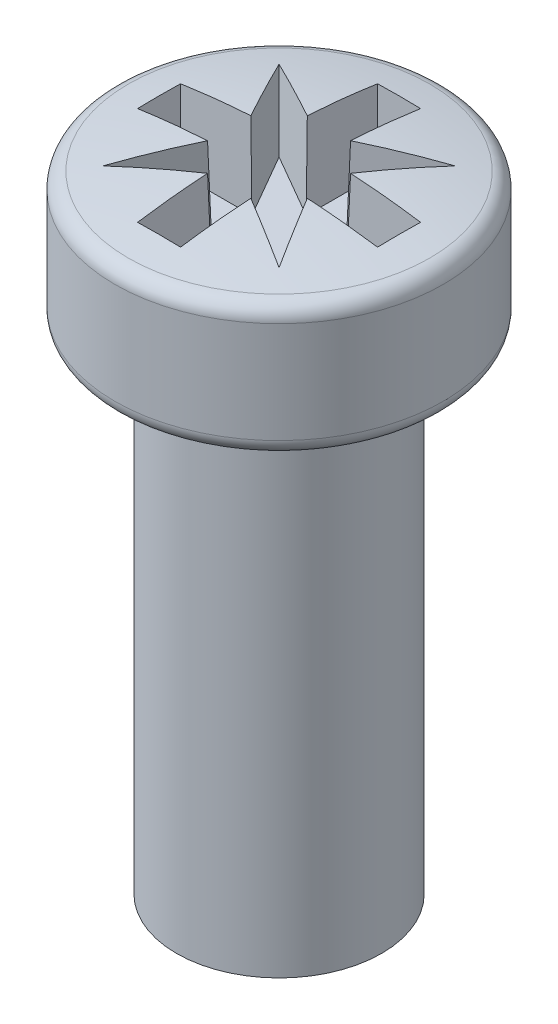
ISO-10303-21;
HEADER;
FILE_DESCRIPTION(('STEP AP214'),'2;1');
FILE_NAME('part.step','',(''),(''),'','','');
FILE_SCHEMA(('AUTOMOTIVE_DESIGN { 1 0 10303 214 1 1 1 1 }'));
ENDSEC;
DATA;
#1=APPLICATION_CONTEXT('core data for automotive mechanical design processes');
#2=APPLICATION_PROTOCOL_DEFINITION('international standard','automotive_design',2000,#1);
#3=PRODUCT_CONTEXT('',#1,'mechanical');
#4=PRODUCT('Part','Part','',(#3));
#5=PRODUCT_RELATED_PRODUCT_CATEGORY('part','',(#4));
#6=PRODUCT_DEFINITION_FORMATION('','',#4);
#7=PRODUCT_DEFINITION_CONTEXT('part definition',#1,'design');
#8=PRODUCT_DEFINITION('design','',#6,#7);
#9=PRODUCT_DEFINITION_SHAPE('','',#8);
#10=(LENGTH_UNIT() NAMED_UNIT(*) SI_UNIT(.MILLI.,.METRE.));
#11=(NAMED_UNIT(*) PLANE_ANGLE_UNIT() SI_UNIT($,.RADIAN.));
#12=(NAMED_UNIT(*) SI_UNIT($,.STERADIAN.) SOLID_ANGLE_UNIT());
#13=UNCERTAINTY_MEASURE_WITH_UNIT(LENGTH_MEASURE(1.E-05),#10,'distance_accuracy_value','');
#14=(GEOMETRIC_REPRESENTATION_CONTEXT(3) GLOBAL_UNCERTAINTY_ASSIGNED_CONTEXT((#13)) GLOBAL_UNIT_ASSIGNED_CONTEXT((#10,
#11,#12)) REPRESENTATION_CONTEXT('',''));
#15=CARTESIAN_POINT('',(0.,0.,0.));
#16=DIRECTION('',(0.,0.,1.));
#17=DIRECTION('',(1.,0.,0.));
#18=AXIS2_PLACEMENT_3D('',#15,#16,#17);
#19=CARTESIAN_POINT('',(1.45,0.75,0.25));
#20=DIRECTION('',(0.,1.,0.));
#21=DIRECTION('',(0.,0.,1.));
#22=AXIS2_PLACEMENT_3D('',#19,#20,#21);
#23=PLANE('',#22);
#24=DIRECTION('',(0.866025403784437,0.,0.500000000000003));
#25=VECTOR('',#24,1.);
#26=CARTESIAN_POINT('',(1.04261448545027,0.75,1.0366534699211));
#27=LINE('',#26,#25);
#28=CARTESIAN_POINT('',(0.245636233767946,0.75,0.576517861774035));
#29=VERTEX_POINT('',#28);
#30=CARTESIAN_POINT('',(1.02851057127591,0.75,1.02851057127591));
#31=VERTEX_POINT('',#30);
#32=EDGE_CURVE('E402',#29,#31,#27,.T.);
#33=ORIENTED_EDGE('',*,*,#32,.T.);
#34=DIRECTION('',(-0.500000000000003,0.,-0.866025403784437));
#35=VECTOR('',#34,1.);
#36=CARTESIAN_POINT('',(0.580296994187172,0.75,0.252181883116027));
#37=LINE('',#36,#35);
#38=CARTESIAN_POINT('',(0.576517861774036,0.75,0.245636233767945));
#39=VERTEX_POINT('',#38);
#40=EDGE_CURVE('E407',#31,#39,#37,.T.);
#41=ORIENTED_EDGE('',*,*,#40,.T.);
#42=DIRECTION('',(1.,0.,0.));
#43=VECTOR('',#42,1.);
#44=CARTESIAN_POINT('',(0.584076126600307,0.75,0.245636233767946));
#45=LINE('',#44,#43);
#46=CARTESIAN_POINT('',(1.44563623376795,0.75,0.245636233767946));
#47=VERTEX_POINT('',#46);
#48=EDGE_CURVE('E420',#39,#47,#45,.T.);
#49=ORIENTED_EDGE('',*,*,#48,.T.);
#50=DIRECTION('',(0.,0.,1.));
#51=VECTOR('',#50,1.);
#52=CARTESIAN_POINT('',(1.44563623376795,0.75,0.25));
#53=LINE('',#52,#51);
#54=CARTESIAN_POINT('',(1.44563623376795,0.75,-0.245636233767946));
#55=VERTEX_POINT('',#54);
#56=EDGE_CURVE('E416',#47,#55,#53,.F.);
#57=ORIENTED_EDGE('',*,*,#56,.T.);
#58=DIRECTION('',(1.,0.,0.));
#59=VECTOR('',#58,1.);
#60=CARTESIAN_POINT('',(0.584076126600307,0.75,-0.245636233767946));
#61=LINE('',#60,#59);
#62=CARTESIAN_POINT('',(0.576517861774036,0.75,-0.245636233767946));
#63=VERTEX_POINT('',#62);
#64=EDGE_CURVE('E410',#55,#63,#61,.F.);
#65=ORIENTED_EDGE('',*,*,#64,.T.);
#66=DIRECTION('',(0.500000000000002,0.,-0.866025403784438));
#67=VECTOR('',#66,1.);
#68=CARTESIAN_POINT('',(0.580296994187172,0.75,-0.252181883116027));
#69=LINE('',#68,#67);
#70=CARTESIAN_POINT('',(1.02851057127591,0.75,-1.02851057127591));
#71=VERTEX_POINT('',#70);
#72=EDGE_CURVE('E424',#63,#71,#69,.T.);
#73=ORIENTED_EDGE('',*,*,#72,.T.);
#74=DIRECTION('',(-0.866025403784437,0.,0.500000000000004));
#75=VECTOR('',#74,1.);
#76=CARTESIAN_POINT('',(1.04261448545027,0.75,-1.03665346992111));
#77=LINE('',#76,#75);
#78=CARTESIAN_POINT('',(0.245636233767946,0.75,-0.576517861774035));
#79=VERTEX_POINT('',#78);
#80=EDGE_CURVE('E429',#71,#79,#77,.T.);
#81=ORIENTED_EDGE('',*,*,#80,.T.);
#82=DIRECTION('',(0.,0.,1.));
#83=VECTOR('',#82,1.);
#84=CARTESIAN_POINT('',(0.245636233767946,0.75,-1.45));
#85=LINE('',#84,#83);
#86=CARTESIAN_POINT('',(0.245636233767946,0.75,-1.44563623376794));
#87=VERTEX_POINT('',#86);
#88=EDGE_CURVE('E273',#79,#87,#85,.F.);
#89=ORIENTED_EDGE('',*,*,#88,.T.);
#90=DIRECTION('',(1.,0.,0.));
#91=VECTOR('',#90,1.);
#92=CARTESIAN_POINT('',(-0.250000000000001,0.75,-1.44563623376795));
#93=LINE('',#92,#91);
#94=CARTESIAN_POINT('',(-0.245636233767947,0.75,-1.44563623376795));
#95=VERTEX_POINT('',#94);
#96=EDGE_CURVE('E274',#87,#95,#93,.F.);
#97=ORIENTED_EDGE('',*,*,#96,.T.);
#98=DIRECTION('',(0.,0.,1.));
#99=VECTOR('',#98,1.);
#100=CARTESIAN_POINT('',(-0.245636233767947,0.75,-1.45));
#101=LINE('',#100,#99);
#102=CARTESIAN_POINT('',(-0.245636233767946,0.75,-0.576517861774035));
#103=VERTEX_POINT('',#102);
#104=EDGE_CURVE('E279',#95,#103,#101,.T.);
#105=ORIENTED_EDGE('',*,*,#104,.T.);
#106=DIRECTION('',(-0.866025403784437,0.,-0.500000000000004));
#107=VECTOR('',#106,1.);
#108=CARTESIAN_POINT('',(-1.04261448545027,0.75,-1.03665346992111));
#109=LINE('',#108,#107);
#110=CARTESIAN_POINT('',(-1.02851057127591,0.75,-1.02851057127591));
#111=VERTEX_POINT('',#110);
#112=EDGE_CURVE('E284',#103,#111,#109,.T.);
#113=ORIENTED_EDGE('',*,*,#112,.T.);
#114=DIRECTION('',(0.500000000000002,0.,0.866025403784438));
#115=VECTOR('',#114,1.);
#116=CARTESIAN_POINT('',(-0.580296994187172,0.75,-0.252181883116027));
#117=LINE('',#116,#115);
#118=CARTESIAN_POINT('',(-0.576517861774036,0.75,-0.245636233767945));
#119=VERTEX_POINT('',#118);
#120=EDGE_CURVE('E289',#111,#119,#117,.T.);
#121=ORIENTED_EDGE('',*,*,#120,.T.);
#122=DIRECTION('',(1.,0.,0.));
#123=VECTOR('',#122,1.);
#124=CARTESIAN_POINT('',(-0.584076126600307,0.75,-0.245636233767946));
#125=LINE('',#124,#123);
#126=CARTESIAN_POINT('',(-1.44563623376795,0.75,-0.245636233767946));
#127=VERTEX_POINT('',#126);
#128=EDGE_CURVE('E294',#119,#127,#125,.F.);
#129=ORIENTED_EDGE('',*,*,#128,.T.);
#130=DIRECTION('',(0.,0.,1.));
#131=VECTOR('',#130,1.);
#132=CARTESIAN_POINT('',(-1.44563623376795,0.75,0.250000000000001));
#133=LINE('',#132,#131);
#134=CARTESIAN_POINT('',(-1.44563623376795,0.75,0.245636233767947));
#135=VERTEX_POINT('',#134);
#136=EDGE_CURVE('E453',#127,#135,#133,.T.);
#137=ORIENTED_EDGE('',*,*,#136,.T.);
#138=DIRECTION('',(1.,0.,0.));
#139=VECTOR('',#138,1.);
#140=CARTESIAN_POINT('',(-0.584076126600307,0.75,0.245636233767946));
#141=LINE('',#140,#139);
#142=CARTESIAN_POINT('',(-0.576517861774036,0.75,0.245636233767946));
#143=VERTEX_POINT('',#142);
#144=EDGE_CURVE('E458',#135,#143,#141,.T.);
#145=ORIENTED_EDGE('',*,*,#144,.T.);
#146=DIRECTION('',(-0.500000000000003,0.,0.866025403784437));
#147=VECTOR('',#146,1.);
#148=CARTESIAN_POINT('',(-0.580296994187172,0.75,0.252181883116027));
#149=LINE('',#148,#147);
#150=CARTESIAN_POINT('',(-1.02851057127591,0.75,1.02851057127591));
#151=VERTEX_POINT('',#150);
#152=EDGE_CURVE('E463',#143,#151,#149,.T.);
#153=ORIENTED_EDGE('',*,*,#152,.T.);
#154=DIRECTION('',(0.866025403784437,0.,-0.500000000000003));
#155=VECTOR('',#154,1.);
#156=CARTESIAN_POINT('',(-1.04261448545027,0.75,1.0366534699211));
#157=LINE('',#156,#155);
#158=CARTESIAN_POINT('',(-0.245636233767946,0.75,0.576517861774035));
#159=VERTEX_POINT('',#158);
#160=EDGE_CURVE('E468',#151,#159,#157,.T.);
#161=ORIENTED_EDGE('',*,*,#160,.T.);
#162=DIRECTION('',(0.,0.,1.));
#163=VECTOR('',#162,1.);
#164=CARTESIAN_POINT('',(-0.245636233767945,0.75,1.45));
#165=LINE('',#164,#163);
#166=CARTESIAN_POINT('',(-0.245636233767945,0.75,1.44563623376795));
#167=VERTEX_POINT('',#166);
#168=EDGE_CURVE('E391',#159,#167,#165,.T.);
#169=ORIENTED_EDGE('',*,*,#168,.T.);
#170=DIRECTION('',(1.,0.,0.));
#171=VECTOR('',#170,1.);
#172=CARTESIAN_POINT('',(-0.25,0.75,1.44563623376795));
#173=LINE('',#172,#171);
#174=CARTESIAN_POINT('',(0.245636233767947,0.75,1.44563623376795));
#175=VERTEX_POINT('',#174);
#176=EDGE_CURVE('E392',#167,#175,#173,.T.);
#177=ORIENTED_EDGE('',*,*,#176,.T.);
#178=DIRECTION('',(0.,0.,1.));
#179=VECTOR('',#178,1.);
#180=CARTESIAN_POINT('',(0.245636233767947,0.75,1.45));
#181=LINE('',#180,#179);
#182=EDGE_CURVE('E397',#175,#29,#181,.F.);
#183=ORIENTED_EDGE('',*,*,#182,.T.);
#184=EDGE_LOOP('',(#33,#41,#49,#57,#65,#73,#81,#89,#97,#105,#113,#121,#129,#137,#145,#153,#161,
#169,#177,#183));
#185=FACE_BOUND('',#184,.T.);
#186=ADVANCED_FACE('F17',(#185),#23,.T.);
#187=CARTESIAN_POINT('',(0.584076126600307,1.,0.25));
#188=DIRECTION('',(0.,-0.0174524064372835,0.999847695156391));
#189=DIRECTION('',(0.,-0.999847695156391,-0.0174524064372835));
#190=AXIS2_PLACEMENT_3D('',#187,#188,#189);
#191=PLANE('',#190);
#192=ORIENTED_EDGE('',*,*,#48,.F.);
#193=DIRECTION('',(0.0302146533529296,0.999391197828466,0.0174444382467851));
#194=VECTOR('',#193,1.);
#195=CARTESIAN_POINT('',(0.576517861774036,0.75,0.245636233767945));
#196=LINE('',#195,#194);
#197=CARTESIAN_POINT('',(0.607598757212809,1.77804334093299,0.263580797282622));
#198=VERTEX_POINT('',#197);
#199=EDGE_CURVE('E405',#39,#198,#196,.T.);
#200=ORIENTED_EDGE('',*,*,#199,.T.);
#201=CARTESIAN_POINT('',(1.46202785908939,1.68907558573134,0.262027859089389));
#202=CARTESIAN_POINT('',(1.32026032340579,1.71002232539284,0.262393485790215));
#203=CARTESIAN_POINT('',(1.17817413049149,1.72790967481918,0.262705710635846));
#204=CARTESIAN_POINT('',(0.893364430201512,1.7575655932015,0.263223356616717));
#205=CARTESIAN_POINT('',(0.750640922825825,1.7693341621575,0.263428777751957));
#206=CARTESIAN_POINT('',(0.607598758219443,1.77804334087832,0.263580797032002));
#207=B_SPLINE_CURVE_WITH_KNOTS('',3,(#201,#202,#203,#204,#205,#206),.UNSPECIFIED.,.F.,.F.,(4,2,
4),(0.,0.429624101670975,0.85924820334195),.UNSPECIFIED.);
#208=CARTESIAN_POINT('',(1.46202785908939,1.68907558573134,0.26202785908939));
#209=VERTEX_POINT('',#208);
#210=EDGE_CURVE('E178',#209,#198,#207,.T.);
#211=ORIENTED_EDGE('',*,*,#210,.F.);
#212=DIRECTION('',(-0.0174497491606828,-0.999695459881887,-0.0174497491606827));
#213=VECTOR('',#212,1.);
#214=CARTESIAN_POINT('',(1.46202785908939,1.68907558573133,0.26202785908939));
#215=LINE('',#214,#213);
#216=EDGE_CURVE('E174',#209,#47,#215,.T.);
#217=ORIENTED_EDGE('',*,*,#216,.T.);
#218=EDGE_LOOP('',(#192,#200,#211,#217));
#219=FACE_BOUND('',#218,.T.);
#220=ADVANCED_FACE('F703',(#219),#191,.F.);
#221=CARTESIAN_POINT('',(0.584076126600307,1.,0.25));
#222=DIRECTION('',(0.865893503920752,-0.0174524064372836,-0.499923847578198));
#223=DIRECTION('',(-0.500000000000003,0.,-0.866025403784437));
#224=AXIS2_PLACEMENT_3D('',#221,#222,#223);
#225=PLANE('',#224);
#226=ORIENTED_EDGE('',*,*,#40,.F.);
#227=DIRECTION('',(0.0475800424954295,0.997733571206395,0.0475800424954295));
#228=VECTOR('',#227,1.);
#229=CARTESIAN_POINT('',(1.02851057127591,0.75,1.02851057127591));
#230=LINE('',#229,#228);
#231=CARTESIAN_POINT('',(1.07306003218654,1.68418354416022,1.07306003218654));
#232=VERTEX_POINT('',#231);
#233=EDGE_CURVE('E400',#31,#232,#230,.T.);
#234=ORIENTED_EDGE('',*,*,#233,.T.);
#235=CARTESIAN_POINT('',(0.607598757356492,1.77804334091766,0.263580797532024));
#236=CARTESIAN_POINT('',(0.685653461591582,1.76970725355828,0.399066524929171));
#237=CARTESIAN_POINT('',(0.763469253278298,1.75771756014881,0.53426599151562));
#238=CARTESIAN_POINT('',(0.918623011554979,1.72643096122967,0.804092403067125));
#239=CARTESIAN_POINT('',(0.995960978144946,1.70713405571999,0.93871934803218));
#240=CARTESIAN_POINT('',(1.07306003218654,1.68418354416022,1.07306003218654));
#241=B_SPLINE_CURVE_WITH_KNOTS('',3,(#235,#236,#237,#238,#239,#240),.UNSPECIFIED.,.F.,.F.,(4,2,
4),(0.,0.469362880447843,0.938725760895685),.UNSPECIFIED.);
#242=EDGE_CURVE('E937',#198,#232,#241,.T.);
#243=ORIENTED_EDGE('',*,*,#242,.F.);
#244=ORIENTED_EDGE('',*,*,#199,.F.);
#245=EDGE_LOOP('',(#226,#234,#243,#244));
#246=FACE_BOUND('',#245,.T.);
#247=ADVANCED_FACE('F695',(#246),#225,.F.);
#248=CARTESIAN_POINT('',(1.04043260233424,1.,1.04043260233424));
#249=DIRECTION('',(-0.499923847578198,-0.0174524064372836,0.865893503920752));
#250=DIRECTION('',(0.866025403784437,0.,0.500000000000003));
#251=AXIS2_PLACEMENT_3D('',#248,#249,#250);
#252=PLANE('',#251);
#253=ORIENTED_EDGE('',*,*,#32,.F.);
#254=DIRECTION('',(0.017444438246785,0.999391197828466,0.0302146533529295));
#255=VECTOR('',#254,1.);
#256=CARTESIAN_POINT('',(0.245636233767946,0.75,0.576517861774035));
#257=LINE('',#256,#255);
#258=CARTESIAN_POINT('',(0.26358079703322,1.77804334094833,0.607598757069126));
#259=VERTEX_POINT('',#258);
#260=EDGE_CURVE('E395',#29,#259,#257,.T.);
#261=ORIENTED_EDGE('',*,*,#260,.T.);
#262=CARTESIAN_POINT('',(1.07306003218653,1.68418354416022,1.07306003218654));
#263=CARTESIAN_POINT('',(0.938719347949565,1.7071340557341,0.995960978097533));
#264=CARTESIAN_POINT('',(0.804092402901637,1.72643096125338,0.918623011459912));
#265=CARTESIAN_POINT('',(0.534265991183865,1.75771756018275,0.763469253087442));
#266=CARTESIAN_POINT('',(0.399066524514021,1.76970725359284,0.685653461352592));
#267=CARTESIAN_POINT('',(0.263580797033219,1.77804334094834,0.607598757069127));
#268=B_SPLINE_CURVE_WITH_KNOTS('',3,(#262,#263,#264,#265,#266,#267),.UNSPECIFIED.,.F.,.F.,(4,2,
4),(0.,0.469362880736001,0.938725761472001),.UNSPECIFIED.);
#269=EDGE_CURVE('E933',#232,#259,#268,.T.);
#270=ORIENTED_EDGE('',*,*,#269,.F.);
#271=ORIENTED_EDGE('',*,*,#233,.F.);
#272=EDGE_LOOP('',(#253,#261,#270,#271));
#273=FACE_BOUND('',#272,.T.);
#274=ADVANCED_FACE('F687',(#273),#252,.F.);
#275=CARTESIAN_POINT('',(0.250000000000001,1.,1.45));
#276=DIRECTION('',(0.999847695156391,-0.0174524064372835,0.));
#277=DIRECTION('',(0.0174524064372835,0.999847695156391,0.));
#278=AXIS2_PLACEMENT_3D('',#275,#276,#277);
#279=PLANE('',#278);
#280=ORIENTED_EDGE('',*,*,#182,.F.);
#281=DIRECTION('',(0.0174497491606828,0.999695459881887,0.0174497491606828));
#282=VECTOR('',#281,1.);
#283=CARTESIAN_POINT('',(0.245636233767947,0.75,1.44563623376795));
#284=LINE('',#283,#282);
#285=CARTESIAN_POINT('',(0.262027859089391,1.68907558573133,1.46202785908939));
#286=VERTEX_POINT('',#285);
#287=EDGE_CURVE('E384',#175,#286,#284,.T.);
#288=ORIENTED_EDGE('',*,*,#287,.T.);
#289=CARTESIAN_POINT('',(0.263580797033219,1.77804334094834,0.607598757069126));
#290=CARTESIAN_POINT('',(0.26342877775326,1.76933416223229,0.750640921868584));
#291=CARTESIAN_POINT('',(0.263223356617962,1.75756559327285,0.893364429436668));
#292=CARTESIAN_POINT('',(0.262705710636685,1.72790967486718,1.17817413011009));
#293=CARTESIAN_POINT('',(0.262393485790708,1.71002232542096,1.32026032321543));
#294=CARTESIAN_POINT('',(0.262027859089391,1.68907558573134,1.46202785908939));
#295=B_SPLINE_CURVE_WITH_KNOTS('',3,(#289,#290,#291,#292,#293,#294),.UNSPECIFIED.,.F.,.F.,(4,2,
4),(0.,0.429624102247064,0.859248204494128),.UNSPECIFIED.);
#296=EDGE_CURVE('E381',#259,#286,#295,.T.);
#297=ORIENTED_EDGE('',*,*,#296,.F.);
#298=ORIENTED_EDGE('',*,*,#260,.F.);
#299=EDGE_LOOP('',(#280,#288,#297,#298));
#300=FACE_BOUND('',#299,.T.);
#301=ADVANCED_FACE('F371',(#300),#279,.F.);
#302=CARTESIAN_POINT('',(-0.25,1.,1.45));
#303=DIRECTION('',(0.,-0.0174524064372835,0.999847695156391));
#304=DIRECTION('',(0.,-0.999847695156391,-0.0174524064372835));
#305=AXIS2_PLACEMENT_3D('',#302,#303,#304);
#306=PLANE('',#305);
#307=ORIENTED_EDGE('',*,*,#176,.F.);
#308=DIRECTION('',(-0.0174497491606827,0.999695459881887,0.0174497491606828));
#309=VECTOR('',#308,1.);
#310=CARTESIAN_POINT('',(-0.245636233767945,0.75,1.44563623376795));
#311=LINE('',#310,#309);
#312=CARTESIAN_POINT('',(-0.26202785908939,1.68907558573134,1.46202785908939));
#313=VERTEX_POINT('',#312);
#314=EDGE_CURVE('E470',#167,#313,#311,.T.);
#315=ORIENTED_EDGE('',*,*,#314,.T.);
#316=CARTESIAN_POINT('',(0.262027859089391,1.68907558573133,1.46202785908939));
#317=CARTESIAN_POINT('',(0.,1.69600058834905,1.46214873545971));
#318=CARTESIAN_POINT('',(-0.26202785908939,1.68907558573133,1.46202785908939));
#319=B_SPLINE_CURVE_WITH_KNOTS('',2,(#316,#317,#318),.UNSPECIFIED.,.F.,.F.,(3,3),(0.,1.),.UNSPECIFIED.);
#320=EDGE_CURVE('E376',#286,#313,#319,.T.);
#321=ORIENTED_EDGE('',*,*,#320,.F.);
#322=ORIENTED_EDGE('',*,*,#287,.F.);
#323=EDGE_LOOP('',(#307,#315,#321,#322));
#324=FACE_BOUND('',#323,.T.);
#325=ADVANCED_FACE('F366',(#324),#306,.F.);
#326=CARTESIAN_POINT('',(-0.25,1.,1.45));
#327=DIRECTION('',(-0.999847695156391,-0.0174524064372835,0.));
#328=DIRECTION('',(0.0174524064372835,-0.999847695156391,0.));
#329=AXIS2_PLACEMENT_3D('',#326,#327,#328);
#330=PLANE('',#329);
#331=ORIENTED_EDGE('',*,*,#168,.F.);
#332=DIRECTION('',(-0.017444438246785,0.999391197828466,0.0302146533529295));
#333=VECTOR('',#332,1.);
#334=CARTESIAN_POINT('',(-0.245636233767946,0.75,0.576517861774035));
#335=LINE('',#334,#333);
#336=CARTESIAN_POINT('',(-0.263580797033221,1.77804334094833,0.607598757069126));
#337=VERTEX_POINT('',#336);
#338=EDGE_CURVE('E465',#159,#337,#335,.T.);
#339=ORIENTED_EDGE('',*,*,#338,.T.);
#340=CARTESIAN_POINT('',(-0.26202785908939,1.68907558573134,1.46202785908939));
#341=CARTESIAN_POINT('',(-0.262393485790707,1.71002232542096,1.32026032321543));
#342=CARTESIAN_POINT('',(-0.262705710636684,1.72790967486718,1.17817413011009));
#343=CARTESIAN_POINT('',(-0.263223356617961,1.75756559327285,0.893364429436668));
#344=CARTESIAN_POINT('',(-0.263428777753261,1.76933416223229,0.750640921868584));
#345=CARTESIAN_POINT('',(-0.263580797033221,1.77804334094834,0.607598757069126));
#346=B_SPLINE_CURVE_WITH_KNOTS('',3,(#340,#341,#342,#343,#344,#345),.UNSPECIFIED.,.F.,.F.,(4,2,
4),(0.,0.429624102247064,0.859248204494128),.UNSPECIFIED.);
#347=EDGE_CURVE('E352',#313,#337,#346,.T.);
#348=ORIENTED_EDGE('',*,*,#347,.F.);
#349=ORIENTED_EDGE('',*,*,#314,.F.);
#350=EDGE_LOOP('',(#331,#339,#348,#349));
#351=FACE_BOUND('',#350,.T.);
#352=ADVANCED_FACE('F361',(#351),#330,.F.);
#353=CARTESIAN_POINT('',(-1.04043260233424,1.,1.04043260233424));
#354=DIRECTION('',(0.499923847578198,-0.0174524064372836,0.865893503920752));
#355=DIRECTION('',(0.866025403784437,0.,-0.500000000000003));
#356=AXIS2_PLACEMENT_3D('',#353,#354,#355);
#357=PLANE('',#356);
#358=ORIENTED_EDGE('',*,*,#160,.F.);
#359=DIRECTION('',(-0.0475800424954293,0.997733571206395,0.0475800424954295));
#360=VECTOR('',#359,1.);
#361=CARTESIAN_POINT('',(-1.02851057127591,0.75,1.02851057127591));
#362=LINE('',#361,#360);
#363=CARTESIAN_POINT('',(-1.07306003218654,1.68418354416022,1.07306003218654));
#364=VERTEX_POINT('',#363);
#365=EDGE_CURVE('E460',#151,#364,#362,.T.);
#366=ORIENTED_EDGE('',*,*,#365,.T.);
#367=CARTESIAN_POINT('',(-0.263580797033221,1.77804334094834,0.607598757069126));
#368=CARTESIAN_POINT('',(-0.399066524514022,1.76970725359284,0.685653461352592));
#369=CARTESIAN_POINT('',(-0.534265991183866,1.75771756018275,0.763469253087442));
#370=CARTESIAN_POINT('',(-0.804092402901637,1.72643096125338,0.918623011459913));
#371=CARTESIAN_POINT('',(-0.938719347949565,1.7071340557341,0.995960978097534));
#372=CARTESIAN_POINT('',(-1.07306003218654,1.68418354416022,1.07306003218654));
#373=B_SPLINE_CURVE_WITH_KNOTS('',3,(#367,#368,#369,#370,#371,#372),.UNSPECIFIED.,.F.,.F.,(4,2,
4),(0.,0.469362880736001,0.938725761472001),.UNSPECIFIED.);
#374=EDGE_CURVE('E346',#337,#364,#373,.T.);
#375=ORIENTED_EDGE('',*,*,#374,.F.);
#376=ORIENTED_EDGE('',*,*,#338,.F.);
#377=EDGE_LOOP('',(#358,#366,#375,#376));
#378=FACE_BOUND('',#377,.T.);
#379=ADVANCED_FACE('F358',(#378),#357,.F.);
#380=CARTESIAN_POINT('',(-0.584076126600307,1.,0.25));
#381=DIRECTION('',(-0.865893503920752,-0.0174524064372836,-0.499923847578198));
#382=DIRECTION('',(-0.500000000000003,0.,0.866025403784437));
#383=AXIS2_PLACEMENT_3D('',#380,#381,#382);
#384=PLANE('',#383);
#385=ORIENTED_EDGE('',*,*,#152,.F.);
#386=DIRECTION('',(-0.0302146533529295,0.999391197828466,0.0174444382467851));
#387=VECTOR('',#386,1.);
#388=CARTESIAN_POINT('',(-0.576517861774036,0.75,0.245636233767946));
#389=LINE('',#388,#387);
#390=CARTESIAN_POINT('',(-0.607598757354815,1.77804334093095,0.263580797032916));
#391=VERTEX_POINT('',#390);
#392=EDGE_CURVE('E455',#143,#391,#389,.T.);
#393=ORIENTED_EDGE('',*,*,#392,.T.);
#394=CARTESIAN_POINT('',(-1.07306003218654,1.68418354416022,1.07306003218654));
#395=CARTESIAN_POINT('',(-0.995960978192184,1.70713405570594,0.938719348114491));
#396=CARTESIAN_POINT('',(-0.918623011649697,1.72643096120604,0.804092403232006));
#397=CARTESIAN_POINT('',(-0.763469253468453,1.757717560115,0.53426599184616));
#398=CARTESIAN_POINT('',(-0.685653461829697,1.76970725352386,0.399066525342798));
#399=CARTESIAN_POINT('',(-0.607598757642805,1.7780433408871,0.263580798028999));
#400=B_SPLINE_CURVE_WITH_KNOTS('',3,(#394,#395,#396,#397,#398,#399),.UNSPECIFIED.,.F.,.F.,(4,2,
4),(0.,0.46936288016074,0.93872576032148),.UNSPECIFIED.);
#401=EDGE_CURVE('E335',#364,#391,#400,.T.);
#402=ORIENTED_EDGE('',*,*,#401,.F.);
#403=ORIENTED_EDGE('',*,*,#365,.F.);
#404=EDGE_LOOP('',(#385,#393,#402,#403));
#405=FACE_BOUND('',#404,.T.);
#406=ADVANCED_FACE('F324',(#405),#384,.F.);
#407=CARTESIAN_POINT('',(-0.584076126600307,1.,0.25));
#408=DIRECTION('',(0.,-0.0174524064372835,0.999847695156391));
#409=DIRECTION('',(0.,-0.999847695156391,-0.0174524064372835));
#410=AXIS2_PLACEMENT_3D('',#407,#408,#409);
#411=PLANE('',#410);
#412=ORIENTED_EDGE('',*,*,#144,.F.);
#413=DIRECTION('',(-0.0174497491606828,0.999695459881887,0.0174497491606827));
#414=VECTOR('',#413,1.);
#415=CARTESIAN_POINT('',(-1.44563623376795,0.75,0.245636233767947));
#416=LINE('',#415,#414);
#417=CARTESIAN_POINT('',(-1.46202785908939,1.68907558573133,0.262027859089391));
#418=VERTEX_POINT('',#417);
#419=EDGE_CURVE('E450',#135,#418,#416,.T.);
#420=ORIENTED_EDGE('',*,*,#419,.T.);
#421=CARTESIAN_POINT('',(-0.607598757640504,1.77804334091356,0.263580797032611));
#422=CARTESIAN_POINT('',(-0.750640922344059,1.76933416219514,0.263428777752611));
#423=CARTESIAN_POINT('',(-0.893364429816576,1.75756559323741,0.263223356617343));
#424=CARTESIAN_POINT('',(-1.17817413029954,1.72790967484334,0.262705710636269));
#425=CARTESIAN_POINT('',(-1.32026032330998,1.71002232540699,0.262393485790463));
#426=CARTESIAN_POINT('',(-1.46202785908939,1.68907558573134,0.262027859089388));
#427=B_SPLINE_CURVE_WITH_KNOTS('',3,(#421,#422,#423,#424,#425,#426),.UNSPECIFIED.,.F.,.F.,(4,2,
4),(0.,0.429624101960912,0.859248203921825),.UNSPECIFIED.);
#428=EDGE_CURVE('E302',#391,#418,#427,.T.);
#429=ORIENTED_EDGE('',*,*,#428,.F.);
#430=ORIENTED_EDGE('',*,*,#392,.F.);
#431=EDGE_LOOP('',(#412,#420,#429,#430));
#432=FACE_BOUND('',#431,.T.);
#433=ADVANCED_FACE('F316',(#432),#411,.F.);
#434=CARTESIAN_POINT('',(-1.45,1.,0.250000000000001));
#435=DIRECTION('',(-0.999847695156391,-0.0174524064372835,0.));
#436=DIRECTION('',(0.0174524064372835,-0.999847695156391,0.));
#437=AXIS2_PLACEMENT_3D('',#434,#435,#436);
#438=PLANE('',#437);
#439=ORIENTED_EDGE('',*,*,#136,.F.);
#440=DIRECTION('',(-0.0174497491606828,0.999695459881887,-0.0174497491606827));
#441=VECTOR('',#440,1.);
#442=CARTESIAN_POINT('',(-1.44563623376795,0.75,-0.245636233767946));
#443=LINE('',#442,#441);
#444=CARTESIAN_POINT('',(-1.46202785908939,1.68907558573134,-0.262027859089391));
#445=VERTEX_POINT('',#444);
#446=EDGE_CURVE('E292',#127,#445,#443,.T.);
#447=ORIENTED_EDGE('',*,*,#446,.T.);
#448=CARTESIAN_POINT('',(-1.46208828672152,1.69253748245776,0.));
#449=CARTESIAN_POINT('',(-1.46208828672152,1.69253748245776,-0.131036805700613));
#450=CARTESIAN_POINT('',(-1.46202785908939,1.68907558573133,-0.262027859089391));
#451=B_SPLINE_CURVE_WITH_KNOTS('',2,(#448,#449,#450),.UNSPECIFIED.,.F.,.F.,(3,3),(0.,1.),.UNSPECIFIED.);
#452=CARTESIAN_POINT('',(-1.46208828672152,1.69253748245776,0.));
#453=VERTEX_POINT('',#452);
#454=EDGE_CURVE('E301',#453,#445,#451,.T.);
#455=ORIENTED_EDGE('',*,*,#454,.F.);
#456=CARTESIAN_POINT('',(-1.46202785908939,1.68907558573133,0.262027859089391));
#457=CARTESIAN_POINT('',(-1.46208828672152,1.69253748245776,0.131036805700616));
#458=CARTESIAN_POINT('',(-1.46208828672152,1.69253748245776,0.));
#459=B_SPLINE_CURVE_WITH_KNOTS('',2,(#456,#457,#458),.UNSPECIFIED.,.F.,.F.,(3,3),(0.,1.),.UNSPECIFIED.);
#460=EDGE_CURVE('E297',#418,#453,#459,.T.);
#461=ORIENTED_EDGE('',*,*,#460,.F.);
#462=ORIENTED_EDGE('',*,*,#419,.F.);
#463=EDGE_LOOP('',(#439,#447,#455,#461,#462));
#464=FACE_BOUND('',#463,.T.);
#465=ADVANCED_FACE('F305',(#464),#438,.F.);
#466=CARTESIAN_POINT('',(-0.584076126600307,1.,-0.25));
#467=DIRECTION('',(0.,-0.0174524064372835,-0.999847695156391));
#468=DIRECTION('',(0.,0.999847695156391,-0.0174524064372835));
#469=AXIS2_PLACEMENT_3D('',#466,#467,#468);
#470=PLANE('',#469);
#471=ORIENTED_EDGE('',*,*,#128,.F.);
#472=DIRECTION('',(-0.0302146533529295,0.999391197828466,-0.017444438246785));
#473=VECTOR('',#472,1.);
#474=CARTESIAN_POINT('',(-0.576517861774036,0.75,-0.245636233767945));
#475=LINE('',#474,#473);
#476=CARTESIAN_POINT('',(-0.607598757212808,1.77804334093299,-0.263580797282623));
#477=VERTEX_POINT('',#476);
#478=EDGE_CURVE('E287',#119,#477,#475,.T.);
#479=ORIENTED_EDGE('',*,*,#478,.T.);
#480=CARTESIAN_POINT('',(-1.46202785908939,1.68907558573134,-0.262027859089392));
#481=CARTESIAN_POINT('',(-1.32026032340579,1.71002232539284,-0.262393485790217));
#482=CARTESIAN_POINT('',(-1.1781741304915,1.72790967481918,-0.262705710635847));
#483=CARTESIAN_POINT('',(-0.893364430201513,1.7575655932015,-0.263223356616716));
#484=CARTESIAN_POINT('',(-0.750640922825827,1.7693341621575,-0.263428777751954));
#485=CARTESIAN_POINT('',(-0.607598758219444,1.77804334087832,-0.263580797031997));
#486=B_SPLINE_CURVE_WITH_KNOTS('',3,(#480,#481,#482,#483,#484,#485),.UNSPECIFIED.,.F.,.F.,(4,2,
4),(0.,0.429624101670975,0.85924820334195),.UNSPECIFIED.);
#487=EDGE_CURVE('E336',#445,#477,#486,.T.);
#488=ORIENTED_EDGE('',*,*,#487,.F.);
#489=ORIENTED_EDGE('',*,*,#446,.F.);
#490=EDGE_LOOP('',(#471,#479,#488,#489));
#491=FACE_BOUND('',#490,.T.);
#492=ADVANCED_FACE('F315',(#491),#470,.F.);
#493=CARTESIAN_POINT('',(-0.584076126600307,1.,-0.25));
#494=DIRECTION('',(-0.865893503920753,-0.0174524064372836,0.499923847578197));
#495=DIRECTION('',(0.500000000000002,0.,0.866025403784438));
#496=AXIS2_PLACEMENT_3D('',#493,#494,#495);
#497=PLANE('',#496);
#498=ORIENTED_EDGE('',*,*,#120,.F.);
#499=DIRECTION('',(-0.0475800424954292,0.997733571206395,-0.0475800424954295));
#500=VECTOR('',#499,1.);
#501=CARTESIAN_POINT('',(-1.02851057127591,0.75,-1.02851057127591));
#502=LINE('',#501,#500);
#503=CARTESIAN_POINT('',(-1.07306003218653,1.68418354416022,-1.07306003218654));
#504=VERTEX_POINT('',#503);
#505=EDGE_CURVE('E282',#111,#504,#502,.T.);
#506=ORIENTED_EDGE('',*,*,#505,.T.);
#507=CARTESIAN_POINT('',(-0.60759875735649,1.77804334091766,-0.263580797532026));
#508=CARTESIAN_POINT('',(-0.685653461591581,1.76970725355828,-0.399066524929172));
#509=CARTESIAN_POINT('',(-0.763469253278297,1.75771756014881,-0.53426599151562));
#510=CARTESIAN_POINT('',(-0.918623011554978,1.72643096122967,-0.804092403067123));
#511=CARTESIAN_POINT('',(-0.995960978144943,1.70713405571999,-0.938719348032178));
#512=CARTESIAN_POINT('',(-1.07306003218653,1.68418354416022,-1.07306003218654));
#513=B_SPLINE_CURVE_WITH_KNOTS('',3,(#507,#508,#509,#510,#511,#512),.UNSPECIFIED.,.F.,.F.,(4,2,
4),(0.,0.46936288044784,0.93872576089568),.UNSPECIFIED.);
#514=EDGE_CURVE('E982',#477,#504,#513,.T.);
#515=ORIENTED_EDGE('',*,*,#514,.F.);
#516=ORIENTED_EDGE('',*,*,#478,.F.);
#517=EDGE_LOOP('',(#498,#506,#515,#516));
#518=FACE_BOUND('',#517,.T.);
#519=ADVANCED_FACE('F633',(#518),#497,.F.);
#520=CARTESIAN_POINT('',(-1.04043260233424,1.,-1.04043260233424));
#521=DIRECTION('',(0.499923847578199,-0.0174524064372835,-0.865893503920752));
#522=DIRECTION('',(-0.866025403784437,0.,-0.500000000000004));
#523=AXIS2_PLACEMENT_3D('',#520,#521,#522);
#524=PLANE('',#523);
#525=ORIENTED_EDGE('',*,*,#112,.F.);
#526=DIRECTION('',(-0.017444438246785,0.999391197828466,-0.0302146533529296));
#527=VECTOR('',#526,1.);
#528=CARTESIAN_POINT('',(-0.245636233767946,0.75,-0.576517861774035));
#529=LINE('',#528,#527);
#530=CARTESIAN_POINT('',(-0.263580797033221,1.77804334094833,-0.607598757069125));
#531=VERTEX_POINT('',#530);
#532=EDGE_CURVE('E277',#103,#531,#529,.T.);
#533=ORIENTED_EDGE('',*,*,#532,.T.);
#534=CARTESIAN_POINT('',(-1.07306003218653,1.68418354416022,-1.07306003218654));
#535=CARTESIAN_POINT('',(-0.938719347949563,1.7071340557341,-0.995960978097532));
#536=CARTESIAN_POINT('',(-0.804092402901635,1.72643096125338,-0.918623011459912));
#537=CARTESIAN_POINT('',(-0.534265991183864,1.75771756018275,-0.763469253087441));
#538=CARTESIAN_POINT('',(-0.399066524514021,1.76970725359284,-0.68565346135259));
#539=CARTESIAN_POINT('',(-0.263580797033222,1.77804334094834,-0.607598757069122));
#540=B_SPLINE_CURVE_WITH_KNOTS('',3,(#534,#535,#536,#537,#538,#539),.UNSPECIFIED.,.F.,.F.,(4,2,
4),(0.,0.469362880736,0.938725761471999),.UNSPECIFIED.);
#541=EDGE_CURVE('E984',#504,#531,#540,.T.);
#542=ORIENTED_EDGE('',*,*,#541,.F.);
#543=ORIENTED_EDGE('',*,*,#505,.F.);
#544=EDGE_LOOP('',(#525,#533,#542,#543));
#545=FACE_BOUND('',#544,.T.);
#546=ADVANCED_FACE('F625',(#545),#524,.F.);
#547=CARTESIAN_POINT('',(-0.250000000000001,1.,-1.45));
#548=DIRECTION('',(-0.999847695156391,-0.0174524064372835,0.));
#549=DIRECTION('',(0.0174524064372835,-0.999847695156391,0.));
#550=AXIS2_PLACEMENT_3D('',#547,#548,#549);
#551=PLANE('',#550);
#552=ORIENTED_EDGE('',*,*,#104,.F.);
#553=DIRECTION('',(-0.0174497491606828,0.999695459881887,-0.0174497491606828));
#554=VECTOR('',#553,1.);
#555=CARTESIAN_POINT('',(-0.245636233767947,0.75,-1.44563623376795));
#556=LINE('',#555,#554);
#557=CARTESIAN_POINT('',(-0.262027859089391,1.68907558573133,-1.46202785908939));
#558=VERTEX_POINT('',#557);
#559=EDGE_CURVE('E266',#95,#558,#556,.T.);
#560=ORIENTED_EDGE('',*,*,#559,.T.);
#561=CARTESIAN_POINT('',(-0.263580797033221,1.77804334094834,-0.607598757069124));
#562=CARTESIAN_POINT('',(-0.263428777753261,1.76933416223229,-0.750640921868581));
#563=CARTESIAN_POINT('',(-0.263223356617962,1.75756559327285,-0.893364429436665));
#564=CARTESIAN_POINT('',(-0.262705710636686,1.72790967486718,-1.17817413011009));
#565=CARTESIAN_POINT('',(-0.262393485790709,1.71002232542096,-1.32026032321542));
#566=CARTESIAN_POINT('',(-0.262027859089393,1.68907558573134,-1.46202785908939));
#567=B_SPLINE_CURVE_WITH_KNOTS('',3,(#561,#562,#563,#564,#565,#566),.UNSPECIFIED.,.F.,.F.,(4,2,
4),(0.,0.429624102247064,0.859248204494128),.UNSPECIFIED.);
#568=EDGE_CURVE('E263',#531,#558,#567,.T.);
#569=ORIENTED_EDGE('',*,*,#568,.F.);
#570=ORIENTED_EDGE('',*,*,#532,.F.);
#571=EDGE_LOOP('',(#552,#560,#569,#570));
#572=FACE_BOUND('',#571,.T.);
#573=ADVANCED_FACE('F253',(#572),#551,.F.);
#574=CARTESIAN_POINT('',(-0.250000000000001,1.,-1.45));
#575=DIRECTION('',(0.,-0.0174524064372835,-0.999847695156391));
#576=DIRECTION('',(0.,0.999847695156391,-0.0174524064372835));
#577=AXIS2_PLACEMENT_3D('',#574,#575,#576);
#578=PLANE('',#577);
#579=ORIENTED_EDGE('',*,*,#96,.F.);
#580=DIRECTION('',(0.0174497491606827,0.999695459881887,-0.0174497491606828));
#581=VECTOR('',#580,1.);
#582=CARTESIAN_POINT('',(0.245636233767946,0.75,-1.44563623376794));
#583=LINE('',#582,#581);
#584=CARTESIAN_POINT('',(0.262027859089391,1.68907558573134,-1.46202785908939));
#585=VERTEX_POINT('',#584);
#586=EDGE_CURVE('E431',#87,#585,#583,.T.);
#587=ORIENTED_EDGE('',*,*,#586,.T.);
#588=CARTESIAN_POINT('',(-0.262027859089391,1.68907558573133,-1.46202785908939));
#589=CARTESIAN_POINT('',(0.,1.69600058834905,-1.46214873545971));
#590=CARTESIAN_POINT('',(0.26202785908939,1.68907558573133,-1.46202785908939));
#591=B_SPLINE_CURVE_WITH_KNOTS('',2,(#588,#589,#590),.UNSPECIFIED.,.F.,.F.,(3,3),(0.,1.),.UNSPECIFIED.);
#592=EDGE_CURVE('E258',#558,#585,#591,.T.);
#593=ORIENTED_EDGE('',*,*,#592,.F.);
#594=ORIENTED_EDGE('',*,*,#559,.F.);
#595=EDGE_LOOP('',(#579,#587,#593,#594));
#596=FACE_BOUND('',#595,.T.);
#597=ADVANCED_FACE('F248',(#596),#578,.F.);
#598=CARTESIAN_POINT('',(0.25,1.,-1.45));
#599=DIRECTION('',(0.999847695156391,-0.0174524064372835,0.));
#600=DIRECTION('',(0.0174524064372835,0.999847695156391,0.));
#601=AXIS2_PLACEMENT_3D('',#598,#599,#600);
#602=PLANE('',#601);
#603=ORIENTED_EDGE('',*,*,#88,.F.);
#604=DIRECTION('',(0.017444438246785,0.999391197828466,-0.0302146533529296));
#605=VECTOR('',#604,1.);
#606=CARTESIAN_POINT('',(0.245636233767946,0.75,-0.576517861774035));
#607=LINE('',#606,#605);
#608=CARTESIAN_POINT('',(0.26358079703322,1.77804334094833,-0.607598757069124));
#609=VERTEX_POINT('',#608);
#610=EDGE_CURVE('E426',#79,#609,#607,.T.);
#611=ORIENTED_EDGE('',*,*,#610,.T.);
#612=CARTESIAN_POINT('',(0.262027859089391,1.68907558573134,-1.46202785908939));
#613=CARTESIAN_POINT('',(0.262393485790707,1.71002232542096,-1.32026032321542));
#614=CARTESIAN_POINT('',(0.262705710636685,1.72790967486718,-1.17817413011009));
#615=CARTESIAN_POINT('',(0.263223356617962,1.75756559327285,-0.893364429436665));
#616=CARTESIAN_POINT('',(0.263428777753262,1.76933416223229,-0.750640921868581));
#617=CARTESIAN_POINT('',(0.263580797033223,1.77804334094834,-0.607598757069124));
#618=B_SPLINE_CURVE_WITH_KNOTS('',3,(#612,#613,#614,#615,#616,#617),.UNSPECIFIED.,.F.,.F.,(4,2,
4),(0.,0.429624102247064,0.859248204494128),.UNSPECIFIED.);
#619=EDGE_CURVE('E234',#585,#609,#618,.T.);
#620=ORIENTED_EDGE('',*,*,#619,.F.);
#621=ORIENTED_EDGE('',*,*,#586,.F.);
#622=EDGE_LOOP('',(#603,#611,#620,#621));
#623=FACE_BOUND('',#622,.T.);
#624=ADVANCED_FACE('F243',(#623),#602,.F.);
#625=CARTESIAN_POINT('',(1.04043260233424,1.,-1.04043260233424));
#626=DIRECTION('',(-0.499923847578199,-0.0174524064372835,-0.865893503920752));
#627=DIRECTION('',(-0.866025403784437,0.,0.500000000000004));
#628=AXIS2_PLACEMENT_3D('',#625,#626,#627);
#629=PLANE('',#628);
#630=ORIENTED_EDGE('',*,*,#80,.F.);
#631=DIRECTION('',(0.0475800424954293,0.997733571206395,-0.0475800424954293));
#632=VECTOR('',#631,1.);
#633=CARTESIAN_POINT('',(1.02851057127591,0.75,-1.02851057127591));
#634=LINE('',#633,#632);
#635=CARTESIAN_POINT('',(1.07306003218654,1.68418354416022,-1.07306003218654));
#636=VERTEX_POINT('',#635);
#637=EDGE_CURVE('E413',#71,#636,#634,.T.);
#638=ORIENTED_EDGE('',*,*,#637,.T.);
#639=CARTESIAN_POINT('',(0.26358079703322,1.77804334094834,-0.607598757069123));
#640=CARTESIAN_POINT('',(0.39906652451402,1.76970725359284,-0.68565346135259));
#641=CARTESIAN_POINT('',(0.534265991183863,1.75771756018275,-0.763469253087442));
#642=CARTESIAN_POINT('',(0.804092402901635,1.72643096125338,-0.918623011459912));
#643=CARTESIAN_POINT('',(0.938719347949564,1.7071340557341,-0.995960978097531));
#644=CARTESIAN_POINT('',(1.07306003218654,1.68418354416022,-1.07306003218653));
#645=B_SPLINE_CURVE_WITH_KNOTS('',3,(#639,#640,#641,#642,#643,#644),.UNSPECIFIED.,.F.,.F.,(4,2,
4),(0.,0.469362880736001,0.938725761472001),.UNSPECIFIED.);
#646=EDGE_CURVE('E228',#609,#636,#645,.T.);
#647=ORIENTED_EDGE('',*,*,#646,.F.);
#648=ORIENTED_EDGE('',*,*,#610,.F.);
#649=EDGE_LOOP('',(#630,#638,#647,#648));
#650=FACE_BOUND('',#649,.T.);
#651=ADVANCED_FACE('F240',(#650),#629,.F.);
#652=CARTESIAN_POINT('',(0.584076126600307,1.,-0.25));
#653=DIRECTION('',(0.865893503920753,-0.0174524064372836,0.499923847578197));
#654=DIRECTION('',(0.500000000000002,0.,-0.866025403784438));
#655=AXIS2_PLACEMENT_3D('',#652,#653,#654);
#656=PLANE('',#655);
#657=ORIENTED_EDGE('',*,*,#72,.F.);
#658=DIRECTION('',(0.0302146533529296,0.999391197828466,-0.017444438246785));
#659=VECTOR('',#658,1.);
#660=CARTESIAN_POINT('',(0.576517861774036,0.75,-0.245636233767946));
#661=LINE('',#660,#659);
#662=CARTESIAN_POINT('',(0.607598757354816,1.77804334093095,-0.263580797032917));
#663=VERTEX_POINT('',#662);
#664=EDGE_CURVE('E412',#63,#663,#661,.T.);
#665=ORIENTED_EDGE('',*,*,#664,.T.);
#666=CARTESIAN_POINT('',(1.07306003218654,1.68418354416022,-1.07306003218654));
#667=CARTESIAN_POINT('',(0.995960978192183,1.70713405570594,-0.938719348114489));
#668=CARTESIAN_POINT('',(0.918623011649695,1.72643096120604,-0.804092403232004));
#669=CARTESIAN_POINT('',(0.763469253468451,1.757717560115,-0.534265991846158));
#670=CARTESIAN_POINT('',(0.685653461829695,1.76970725352386,-0.399066525342796));
#671=CARTESIAN_POINT('',(0.607598757642804,1.7780433408871,-0.263580798028996));
#672=B_SPLINE_CURVE_WITH_KNOTS('',3,(#666,#667,#668,#669,#670,#671),.UNSPECIFIED.,.F.,.F.,(4,2,
4),(0.,0.46936288016074,0.93872576032148),.UNSPECIFIED.);
#673=EDGE_CURVE('E190',#636,#663,#672,.T.);
#674=ORIENTED_EDGE('',*,*,#673,.F.);
#675=ORIENTED_EDGE('',*,*,#637,.F.);
#676=EDGE_LOOP('',(#657,#665,#674,#675));
#677=FACE_BOUND('',#676,.T.);
#678=ADVANCED_FACE('F215',(#677),#656,.F.);
#679=CARTESIAN_POINT('',(0.584076126600307,1.,-0.25));
#680=DIRECTION('',(0.,-0.0174524064372835,-0.999847695156391));
#681=DIRECTION('',(0.,0.999847695156391,-0.0174524064372835));
#682=AXIS2_PLACEMENT_3D('',#679,#680,#681);
#683=PLANE('',#682);
#684=ORIENTED_EDGE('',*,*,#64,.F.);
#685=DIRECTION('',(0.0174497491606828,0.999695459881887,-0.0174497491606828));
#686=VECTOR('',#685,1.);
#687=CARTESIAN_POINT('',(1.44563623376795,0.75,-0.245636233767946));
#688=LINE('',#687,#686);
#689=CARTESIAN_POINT('',(1.46202785908939,1.68907558573133,-0.262027859089391));
#690=VERTEX_POINT('',#689);
#691=EDGE_CURVE('E179',#55,#690,#688,.T.);
#692=ORIENTED_EDGE('',*,*,#691,.T.);
#693=CARTESIAN_POINT('',(0.607598757640505,1.77804334091356,-0.263580797032614));
#694=CARTESIAN_POINT('',(0.750640922177395,1.76933416220529,-0.26342877775279));
#695=CARTESIAN_POINT('',(0.893364429484143,1.75756559326483,-0.263223356617822));
#696=CARTESIAN_POINT('',(1.17817412963735,1.72790967491948,-0.262705710637598));
#697=CARTESIAN_POINT('',(1.32026032248382,1.7100223255146,-0.262393485792342));
#698=CARTESIAN_POINT('',(1.46202785810014,1.68907558587752,-0.262027859091942));
#699=B_SPLINE_CURVE_WITH_KNOTS('',3,(#693,#694,#695,#696,#697,#698),.UNSPECIFIED.,.F.,.F.,(4,2,
4),(0.,0.429624101461028,0.859248202922057),.UNSPECIFIED.);
#700=EDGE_CURVE('E184',#663,#690,#699,.T.);
#701=ORIENTED_EDGE('',*,*,#700,.F.);
#702=ORIENTED_EDGE('',*,*,#664,.F.);
#703=EDGE_LOOP('',(#684,#692,#701,#702));
#704=FACE_BOUND('',#703,.T.);
#705=ADVANCED_FACE('F208',(#704),#683,.F.);
#706=CARTESIAN_POINT('',(1.45,1.,0.25));
#707=DIRECTION('',(0.999847695156391,-0.0174524064372835,0.));
#708=DIRECTION('',(0.0174524064372835,0.999847695156391,0.));
#709=AXIS2_PLACEMENT_3D('',#706,#707,#708);
#710=PLANE('',#709);
#711=ORIENTED_EDGE('',*,*,#56,.F.);
#712=ORIENTED_EDGE('',*,*,#216,.F.);
#713=CARTESIAN_POINT('',(1.46208828672152,1.69253748245776,0.));
#714=CARTESIAN_POINT('',(1.46208828672152,1.69253748245776,0.131036805700615));
#715=CARTESIAN_POINT('',(1.46202785908939,1.68907558573133,0.26202785908939));
#716=B_SPLINE_CURVE_WITH_KNOTS('',2,(#713,#714,#715),.UNSPECIFIED.,.F.,.F.,(3,3),(0.,1.),.UNSPECIFIED.);
#717=CARTESIAN_POINT('',(1.46208828672152,1.69253748245776,0.));
#718=VERTEX_POINT('',#717);
#719=EDGE_CURVE('E166',#718,#209,#716,.T.);
#720=ORIENTED_EDGE('',*,*,#719,.F.);
#721=CARTESIAN_POINT('',(1.46202785908939,1.68907558573133,-0.262027859089391));
#722=CARTESIAN_POINT('',(1.46208828672152,1.69253748245776,-0.131036805700617));
#723=CARTESIAN_POINT('',(1.46208828672152,1.69253748245776,0.));
#724=B_SPLINE_CURVE_WITH_KNOTS('',2,(#721,#722,#723),.UNSPECIFIED.,.F.,.F.,(3,3),(0.,1.),.UNSPECIFIED.);
#725=EDGE_CURVE('E171',#690,#718,#724,.T.);
#726=ORIENTED_EDGE('',*,*,#725,.F.);
#727=ORIENTED_EDGE('',*,*,#691,.F.);
#728=EDGE_LOOP('',(#711,#712,#720,#726,#727));
#729=FACE_BOUND('',#728,.T.);
#730=ADVANCED_FACE('F169',(#729),#710,.F.);
#731=CARTESIAN_POINT('',(0.,-8.2,0.));
#732=DIRECTION('',(-1.,0.,0.));
#733=DIRECTION('',(0.,-1.,0.));
#734=AXIS2_PLACEMENT_3D('',#731,#732,#733);
#735=SPHERICAL_SURFACE('',#734,10.);
#736=CARTESIAN_POINT('',(0.,1.62987312554473,0.));
#737=DIRECTION('',(0.,1.,0.));
#738=DIRECTION('',(0.,0.,1.));
#739=AXIS2_PLACEMENT_3D('',#736,#737,#738);
#740=CIRCLE('',#739,1.83673469387755);
#741=CARTESIAN_POINT('',(0.,1.62987312554473,1.83673469387755));
#742=VERTEX_POINT('',#741);
#743=EDGE_CURVE('E185',#742,#742,#740,.F.);
#744=ORIENTED_EDGE('',*,*,#743,.F.);
#745=EDGE_LOOP('',(#744));
#746=FACE_BOUND('',#745,.T.);
#747=ORIENTED_EDGE('',*,*,#700,.T.);
#748=ORIENTED_EDGE('',*,*,#725,.T.);
#749=ORIENTED_EDGE('',*,*,#719,.T.);
#750=ORIENTED_EDGE('',*,*,#210,.T.);
#751=ORIENTED_EDGE('',*,*,#242,.T.);
#752=ORIENTED_EDGE('',*,*,#269,.T.);
#753=ORIENTED_EDGE('',*,*,#296,.T.);
#754=ORIENTED_EDGE('',*,*,#320,.T.);
#755=ORIENTED_EDGE('',*,*,#347,.T.);
#756=ORIENTED_EDGE('',*,*,#374,.T.);
#757=ORIENTED_EDGE('',*,*,#401,.T.);
#758=ORIENTED_EDGE('',*,*,#428,.T.);
#759=ORIENTED_EDGE('',*,*,#460,.T.);
#760=ORIENTED_EDGE('',*,*,#454,.T.);
#761=ORIENTED_EDGE('',*,*,#487,.T.);
#762=ORIENTED_EDGE('',*,*,#514,.T.);
#763=ORIENTED_EDGE('',*,*,#541,.T.);
#764=ORIENTED_EDGE('',*,*,#568,.T.);
#765=ORIENTED_EDGE('',*,*,#592,.T.);
#766=ORIENTED_EDGE('',*,*,#619,.T.);
#767=ORIENTED_EDGE('',*,*,#646,.T.);
#768=ORIENTED_EDGE('',*,*,#673,.T.);
#769=EDGE_LOOP('',(#747,#748,#749,#750,#751,#752,#753,#754,#755,#756,#757,#758,#759,#760,#761,
#762,#763,#764,#765,#766,#767,#768));
#770=FACE_BOUND('',#769,.T.);
#771=ADVANCED_FACE('F181',(#746,#770),#735,.T.);
#772=CARTESIAN_POINT('',(0.,1.43327566303384,0.));
#773=DIRECTION('',(0.,1.,0.));
#774=DIRECTION('',(0.,0.,1.));
#775=AXIS2_PLACEMENT_3D('',#772,#773,#774);
#776=TOROIDAL_SURFACE('',#775,1.8,0.2);
#777=CARTESIAN_POINT('',(0.,1.43327566303384,0.));
#778=DIRECTION('',(0.,1.,0.));
#779=DIRECTION('',(0.,0.,1.));
#780=AXIS2_PLACEMENT_3D('',#777,#778,#779);
#781=CIRCLE('',#780,2.);
#782=CARTESIAN_POINT('',(0.,1.43327566303384,2.));
#783=VERTEX_POINT('',#782);
#784=EDGE_CURVE('E188',#783,#783,#781,.F.);
#785=ORIENTED_EDGE('',*,*,#784,.F.);
#786=EDGE_LOOP('',(#785));
#787=FACE_BOUND('',#786,.T.);
#788=ORIENTED_EDGE('',*,*,#743,.T.);
#789=EDGE_LOOP('',(#788));
#790=FACE_BOUND('',#789,.T.);
#791=ADVANCED_FACE('F505',(#787,#790),#776,.T.);
#792=CARTESIAN_POINT('',(0.,2.5961827921593,0.));
#793=DIRECTION('',(0.,1.,0.));
#794=DIRECTION('',(0.,0.,1.));
#795=AXIS2_PLACEMENT_3D('',#792,#793,#794);
#796=CYLINDRICAL_SURFACE('',#795,2.);
#797=CARTESIAN_POINT('',(0.,0.2,0.));
#798=DIRECTION('',(0.,1.,0.));
#799=DIRECTION('',(0.,0.,1.));
#800=AXIS2_PLACEMENT_3D('',#797,#798,#799);
#801=CIRCLE('',#800,2.);
#802=CARTESIAN_POINT('',(0.,0.2,2.));
#803=VERTEX_POINT('',#802);
#804=EDGE_CURVE('E493',#803,#803,#801,.F.);
#805=ORIENTED_EDGE('',*,*,#804,.F.);
#806=EDGE_LOOP('',(#805));
#807=FACE_BOUND('',#806,.T.);
#808=ORIENTED_EDGE('',*,*,#784,.T.);
#809=EDGE_LOOP('',(#808));
#810=FACE_BOUND('',#809,.T.);
#811=ADVANCED_FACE('F508',(#807,#810),#796,.T.);
#812=CARTESIAN_POINT('',(0.,0.2,0.));
#813=DIRECTION('',(0.,1.,0.));
#814=DIRECTION('',(0.,0.,1.));
#815=AXIS2_PLACEMENT_3D('',#812,#813,#814);
#816=TOROIDAL_SURFACE('',#815,1.8,0.2);
#817=CARTESIAN_POINT('',(0.,0.,0.));
#818=DIRECTION('',(0.,1.,0.));
#819=DIRECTION('',(0.,0.,1.));
#820=AXIS2_PLACEMENT_3D('',#817,#818,#819);
#821=CIRCLE('',#820,1.8);
#822=CARTESIAN_POINT('',(0.,0.,-1.8));
#823=VERTEX_POINT('',#822);
#824=CARTESIAN_POINT('',(0.,0.,1.8));
#825=VERTEX_POINT('',#824);
#826=EDGE_CURVE('E490',#823,#825,#821,.F.);
#827=ORIENTED_EDGE('',*,*,#826,.F.);
#828=CARTESIAN_POINT('',(0.,0.,0.));
#829=DIRECTION('',(0.,1.,0.));
#830=DIRECTION('',(0.,0.,-1.));
#831=AXIS2_PLACEMENT_3D('',#828,#829,#830);
#832=CIRCLE('',#831,1.8);
#833=EDGE_CURVE('E36',#825,#823,#832,.F.);
#834=ORIENTED_EDGE('',*,*,#833,.F.);
#835=EDGE_LOOP('',(#827,#834));
#836=FACE_BOUND('',#835,.T.);
#837=ORIENTED_EDGE('',*,*,#804,.T.);
#838=EDGE_LOOP('',(#837));
#839=FACE_BOUND('',#838,.T.);
#840=ADVANCED_FACE('F511',(#836,#839),#816,.T.);
#841=CARTESIAN_POINT('',(0.,-6.,0.));
#842=DIRECTION('',(0.,-1.,0.));
#843=DIRECTION('',(0.,0.,-1.));
#844=AXIS2_PLACEMENT_3D('',#841,#842,#843);
#845=PLANE('',#844);
#846=CARTESIAN_POINT('',(0.,-6.,0.));
#847=DIRECTION('',(0.,1.,0.));
#848=DIRECTION('',(0.,0.,1.));
#849=AXIS2_PLACEMENT_3D('',#846,#847,#848);
#850=CIRCLE('',#849,1.25);
#851=CARTESIAN_POINT('',(0.,-6.,1.25));
#852=VERTEX_POINT('',#851);
#853=EDGE_CURVE('E28',#852,#852,#850,.T.);
#854=ORIENTED_EDGE('',*,*,#853,.F.);
#855=EDGE_LOOP('',(#854));
#856=FACE_BOUND('',#855,.T.);
#857=ADVANCED_FACE('F517',(#856),#845,.T.);
#858=CARTESIAN_POINT('',(0.,0.,0.));
#859=DIRECTION('',(0.,-1.,0.));
#860=DIRECTION('',(0.,0.,-1.));
#861=AXIS2_PLACEMENT_3D('',#858,#859,#860);
#862=PLANE('',#861);
#863=CARTESIAN_POINT('',(0.,0.,0.));
#864=DIRECTION('',(0.,1.,0.));
#865=DIRECTION('',(0.,0.,1.));
#866=AXIS2_PLACEMENT_3D('',#863,#864,#865);
#867=CIRCLE('',#866,1.25);
#868=CARTESIAN_POINT('',(0.,0.,1.25));
#869=VERTEX_POINT('',#868);
#870=EDGE_CURVE('E11',#869,#869,#867,.F.);
#871=ORIENTED_EDGE('',*,*,#870,.F.);
#872=EDGE_LOOP('',(#871));
#873=FACE_BOUND('',#872,.T.);
#874=ORIENTED_EDGE('',*,*,#826,.T.);
#875=ORIENTED_EDGE('',*,*,#833,.T.);
#876=EDGE_LOOP('',(#874,#875));
#877=FACE_BOUND('',#876,.T.);
#878=ADVANCED_FACE('F525',(#873,#877),#862,.T.);
#879=CARTESIAN_POINT('',(0.,-6.,0.));
#880=DIRECTION('',(0.,1.,0.));
#881=DIRECTION('',(0.,0.,1.));
#882=AXIS2_PLACEMENT_3D('',#879,#880,#881);
#883=CYLINDRICAL_SURFACE('',#882,1.25);
#884=ORIENTED_EDGE('',*,*,#870,.T.);
#885=EDGE_LOOP('',(#884));
#886=FACE_BOUND('',#885,.T.);
#887=ORIENTED_EDGE('',*,*,#853,.T.);
#888=EDGE_LOOP('',(#887));
#889=FACE_BOUND('',#888,.T.);
#890=ADVANCED_FACE('F534',(#886,#889),#883,.T.);
#891=CLOSED_SHELL('',(#186,#220,#247,#274,#301,#325,#352,#379,#406,#433,#465,#492,#519,#546,
#573,#597,#624,#651,#678,#705,#730,#771,#791,#811,#840,#857,#878,#890));
#892=MANIFOLD_SOLID_BREP('B1',#891);
#893=ADVANCED_BREP_SHAPE_REPRESENTATION('',(#18,#892),#14);
#894=SHAPE_DEFINITION_REPRESENTATION(#9,#893);
ENDSEC;
END-ISO-10303-21;
